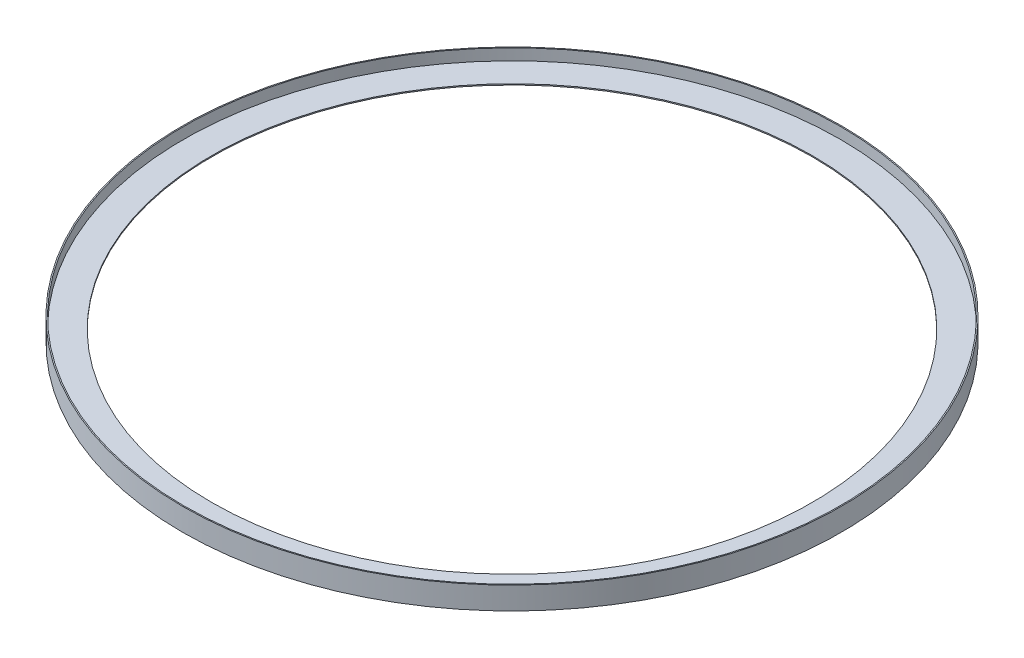
ISO-10303-21;
HEADER;
FILE_DESCRIPTION(('STEP AP214'),'2;1');
FILE_NAME('part.step','',(''),(''),'','','');
FILE_SCHEMA(('AUTOMOTIVE_DESIGN { 1 0 10303 214 1 1 1 1 }'));
ENDSEC;
DATA;
#1=APPLICATION_CONTEXT('core data for automotive mechanical design processes');
#2=APPLICATION_PROTOCOL_DEFINITION('international standard','automotive_design',2000,#1);
#3=PRODUCT_CONTEXT('',#1,'mechanical');
#4=PRODUCT('Part','Part','',(#3));
#5=PRODUCT_RELATED_PRODUCT_CATEGORY('part','',(#4));
#6=PRODUCT_DEFINITION_FORMATION('','',#4);
#7=PRODUCT_DEFINITION_CONTEXT('part definition',#1,'design');
#8=PRODUCT_DEFINITION('design','',#6,#7);
#9=PRODUCT_DEFINITION_SHAPE('','',#8);
#10=(LENGTH_UNIT() NAMED_UNIT(*) SI_UNIT(.MILLI.,.METRE.));
#11=(NAMED_UNIT(*) PLANE_ANGLE_UNIT() SI_UNIT($,.RADIAN.));
#12=(NAMED_UNIT(*) SI_UNIT($,.STERADIAN.) SOLID_ANGLE_UNIT());
#13=UNCERTAINTY_MEASURE_WITH_UNIT(LENGTH_MEASURE(1.E-05),#10,'distance_accuracy_value','');
#14=(GEOMETRIC_REPRESENTATION_CONTEXT(3) GLOBAL_UNCERTAINTY_ASSIGNED_CONTEXT((#13)) GLOBAL_UNIT_ASSIGNED_CONTEXT((#10,
#11,#12)) REPRESENTATION_CONTEXT('',''));
#15=CARTESIAN_POINT('',(0.,0.,0.));
#16=DIRECTION('',(0.,0.,1.));
#17=DIRECTION('',(1.,0.,0.));
#18=AXIS2_PLACEMENT_3D('',#15,#16,#17);
#19=CARTESIAN_POINT('',(0.,0.5,0.));
#20=DIRECTION('',(0.,1.,0.));
#21=DIRECTION('',(0.,0.,1.));
#22=AXIS2_PLACEMENT_3D('',#19,#20,#21);
#23=PLANE('',#22);
#24=CARTESIAN_POINT('',(0.,0.5,0.));
#25=DIRECTION('',(0.,1.,0.));
#26=DIRECTION('',(0.,0.,1.));
#27=AXIS2_PLACEMENT_3D('',#24,#25,#26);
#28=CIRCLE('',#27,292.5);
#29=CARTESIAN_POINT('',(0.,0.5,292.5));
#30=VERTEX_POINT('',#29);
#31=EDGE_CURVE('E50',#30,#30,#28,.F.);
#32=ORIENTED_EDGE('',*,*,#31,.F.);
#33=EDGE_LOOP('',(#32));
#34=FACE_BOUND('',#33,.T.);
#35=CARTESIAN_POINT('',(0.,0.5,0.));
#36=DIRECTION('',(0.,1.,0.));
#37=DIRECTION('',(0.,0.,1.));
#38=AXIS2_PLACEMENT_3D('',#35,#36,#37);
#39=CIRCLE('',#38,267.5);
#40=CARTESIAN_POINT('',(0.,0.5,267.5));
#41=VERTEX_POINT('',#40);
#42=EDGE_CURVE('E41',#41,#41,#39,.T.);
#43=ORIENTED_EDGE('',*,*,#42,.F.);
#44=EDGE_LOOP('',(#43));
#45=FACE_BOUND('',#44,.T.);
#46=ADVANCED_FACE('F34',(#34,#45),#23,.T.);
#47=CARTESIAN_POINT('',(0.,-0.5,0.));
#48=DIRECTION('',(0.,1.,0.));
#49=DIRECTION('',(0.,0.,1.));
#50=AXIS2_PLACEMENT_3D('',#47,#48,#49);
#51=PLANE('',#50);
#52=CARTESIAN_POINT('',(0.,-0.5,0.));
#53=DIRECTION('',(0.,1.,0.));
#54=DIRECTION('',(0.,0.,1.));
#55=AXIS2_PLACEMENT_3D('',#52,#53,#54);
#56=CIRCLE('',#55,292.5);
#57=CARTESIAN_POINT('',(0.,-0.5,292.5));
#58=VERTEX_POINT('',#57);
#59=EDGE_CURVE('E10',#58,#58,#56,.T.);
#60=ORIENTED_EDGE('',*,*,#59,.F.);
#61=EDGE_LOOP('',(#60));
#62=FACE_BOUND('',#61,.T.);
#63=CARTESIAN_POINT('',(0.,-0.5,0.));
#64=DIRECTION('',(0.,1.,0.));
#65=DIRECTION('',(0.,0.,1.));
#66=AXIS2_PLACEMENT_3D('',#63,#64,#65);
#67=CIRCLE('',#66,267.5);
#68=CARTESIAN_POINT('',(0.,-0.5,267.5));
#69=VERTEX_POINT('',#68);
#70=EDGE_CURVE('E45',#69,#69,#67,.T.);
#71=ORIENTED_EDGE('',*,*,#70,.T.);
#72=EDGE_LOOP('',(#71));
#73=FACE_BOUND('',#72,.T.);
#74=ADVANCED_FACE('F36',(#62,#73),#51,.F.);
#75=CARTESIAN_POINT('',(0.,0.5,0.));
#76=DIRECTION('',(0.,-1.,0.));
#77=DIRECTION('',(0.,0.,-1.));
#78=AXIS2_PLACEMENT_3D('',#75,#76,#77);
#79=CYLINDRICAL_SURFACE('',#78,267.5);
#80=ORIENTED_EDGE('',*,*,#42,.T.);
#81=EDGE_LOOP('',(#80));
#82=FACE_BOUND('',#81,.T.);
#83=ORIENTED_EDGE('',*,*,#70,.F.);
#84=EDGE_LOOP('',(#83));
#85=FACE_BOUND('',#84,.T.);
#86=ADVANCED_FACE('F82',(#82,#85),#79,.F.);
#87=CARTESIAN_POINT('',(0.,10.5,0.));
#88=DIRECTION('',(0.,-1.,0.));
#89=DIRECTION('',(0.,0.,-1.));
#90=AXIS2_PLACEMENT_3D('',#87,#88,#89);
#91=CYLINDRICAL_SURFACE('',#90,292.5);
#92=CARTESIAN_POINT('',(0.,-9.5,0.));
#93=DIRECTION('',(0.,1.,0.));
#94=DIRECTION('',(0.,0.,1.));
#95=AXIS2_PLACEMENT_3D('',#92,#93,#94);
#96=CIRCLE('',#95,292.5);
#97=CARTESIAN_POINT('',(0.,-9.5,292.5));
#98=VERTEX_POINT('',#97);
#99=EDGE_CURVE('E61',#98,#98,#96,.T.);
#100=ORIENTED_EDGE('',*,*,#99,.F.);
#101=EDGE_LOOP('',(#100));
#102=FACE_BOUND('',#101,.T.);
#103=ORIENTED_EDGE('',*,*,#59,.T.);
#104=EDGE_LOOP('',(#103));
#105=FACE_BOUND('',#104,.T.);
#106=ADVANCED_FACE('F72',(#102,#105),#91,.F.);
#107=CARTESIAN_POINT('',(0.,10.5,0.));
#108=DIRECTION('',(0.,1.,0.));
#109=DIRECTION('',(0.,0.,1.));
#110=AXIS2_PLACEMENT_3D('',#107,#108,#109);
#111=PLANE('',#110);
#112=CARTESIAN_POINT('',(0.,10.5,0.));
#113=DIRECTION('',(0.,1.,0.));
#114=DIRECTION('',(0.,0.,1.));
#115=AXIS2_PLACEMENT_3D('',#112,#113,#114);
#116=CIRCLE('',#115,293.5);
#117=CARTESIAN_POINT('',(0.,10.5,293.5));
#118=VERTEX_POINT('',#117);
#119=EDGE_CURVE('E54',#118,#118,#116,.T.);
#120=ORIENTED_EDGE('',*,*,#119,.T.);
#121=EDGE_LOOP('',(#120));
#122=FACE_BOUND('',#121,.T.);
#123=CARTESIAN_POINT('',(0.,10.5,0.));
#124=DIRECTION('',(0.,1.,0.));
#125=DIRECTION('',(0.,0.,1.));
#126=AXIS2_PLACEMENT_3D('',#123,#124,#125);
#127=CIRCLE('',#126,292.5);
#128=CARTESIAN_POINT('',(0.,10.5,292.5));
#129=VERTEX_POINT('',#128);
#130=EDGE_CURVE('E58',#129,#129,#127,.T.);
#131=ORIENTED_EDGE('',*,*,#130,.F.);
#132=EDGE_LOOP('',(#131));
#133=FACE_BOUND('',#132,.T.);
#134=ADVANCED_FACE('F69',(#122,#133),#111,.T.);
#135=CARTESIAN_POINT('',(0.,-9.5,0.));
#136=DIRECTION('',(0.,1.,0.));
#137=DIRECTION('',(0.,0.,1.));
#138=AXIS2_PLACEMENT_3D('',#135,#136,#137);
#139=PLANE('',#138);
#140=CARTESIAN_POINT('',(0.,-9.5,0.));
#141=DIRECTION('',(0.,1.,0.));
#142=DIRECTION('',(0.,0.,1.));
#143=AXIS2_PLACEMENT_3D('',#140,#141,#142);
#144=CIRCLE('',#143,293.5);
#145=CARTESIAN_POINT('',(0.,-9.5,293.5));
#146=VERTEX_POINT('',#145);
#147=EDGE_CURVE('E55',#146,#146,#144,.T.);
#148=ORIENTED_EDGE('',*,*,#147,.F.);
#149=EDGE_LOOP('',(#148));
#150=FACE_BOUND('',#149,.T.);
#151=ORIENTED_EDGE('',*,*,#99,.T.);
#152=EDGE_LOOP('',(#151));
#153=FACE_BOUND('',#152,.T.);
#154=ADVANCED_FACE('F71',(#150,#153),#139,.F.);
#155=CARTESIAN_POINT('',(0.,10.5,0.));
#156=DIRECTION('',(0.,-1.,0.));
#157=DIRECTION('',(0.,0.,-1.));
#158=AXIS2_PLACEMENT_3D('',#155,#156,#157);
#159=CYLINDRICAL_SURFACE('',#158,293.5);
#160=ORIENTED_EDGE('',*,*,#119,.F.);
#161=EDGE_LOOP('',(#160));
#162=FACE_BOUND('',#161,.T.);
#163=ORIENTED_EDGE('',*,*,#147,.T.);
#164=EDGE_LOOP('',(#163));
#165=FACE_BOUND('',#164,.T.);
#166=ADVANCED_FACE('F79',(#162,#165),#159,.T.);
#167=ORIENTED_EDGE('',*,*,#31,.T.);
#168=EDGE_LOOP('',(#167));
#169=FACE_BOUND('',#168,.T.);
#170=ORIENTED_EDGE('',*,*,#130,.T.);
#171=EDGE_LOOP('',(#170));
#172=FACE_BOUND('',#171,.T.);
#173=ADVANCED_FACE('F67',(#169,#172),#91,.F.);
#174=CLOSED_SHELL('',(#46,#74,#86,#106,#134,#154,#166,#173));
#175=MANIFOLD_SOLID_BREP('B2',#174);
#176=ADVANCED_BREP_SHAPE_REPRESENTATION('',(#18,#175),#14);
#177=SHAPE_DEFINITION_REPRESENTATION(#9,#176);
ENDSEC;
END-ISO-10303-21;
